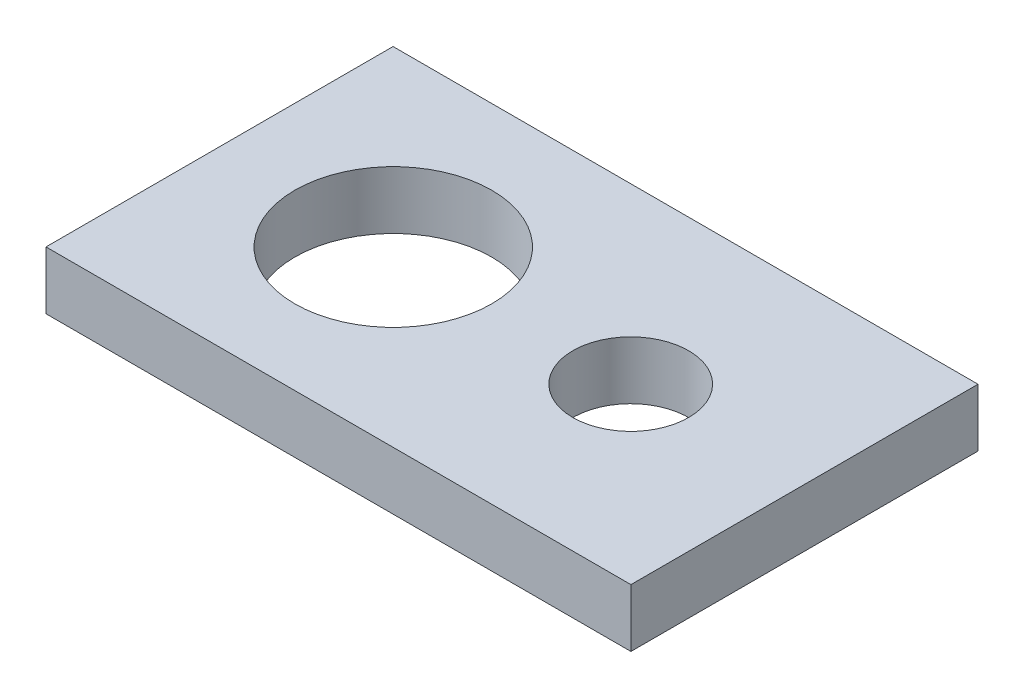
ISO-10303-21;
HEADER;
FILE_DESCRIPTION(('STEP AP214'),'2;1');
FILE_NAME('part.step','',(''),(''),'','','');
FILE_SCHEMA(('AUTOMOTIVE_DESIGN { 1 0 10303 214 1 1 1 1 }'));
ENDSEC;
DATA;
#1=APPLICATION_CONTEXT('core data for automotive mechanical design processes');
#2=APPLICATION_PROTOCOL_DEFINITION('international standard','automotive_design',2000,#1);
#3=PRODUCT_CONTEXT('',#1,'mechanical');
#4=PRODUCT('Part','Part','',(#3));
#5=PRODUCT_RELATED_PRODUCT_CATEGORY('part','',(#4));
#6=PRODUCT_DEFINITION_FORMATION('','',#4);
#7=PRODUCT_DEFINITION_CONTEXT('part definition',#1,'design');
#8=PRODUCT_DEFINITION('design','',#6,#7);
#9=PRODUCT_DEFINITION_SHAPE('','',#8);
#10=(LENGTH_UNIT() NAMED_UNIT(*) SI_UNIT(.MILLI.,.METRE.));
#11=(NAMED_UNIT(*) PLANE_ANGLE_UNIT() SI_UNIT($,.RADIAN.));
#12=(NAMED_UNIT(*) SI_UNIT($,.STERADIAN.) SOLID_ANGLE_UNIT());
#13=UNCERTAINTY_MEASURE_WITH_UNIT(LENGTH_MEASURE(1.E-05),#10,'distance_accuracy_value','');
#14=(GEOMETRIC_REPRESENTATION_CONTEXT(3) GLOBAL_UNCERTAINTY_ASSIGNED_CONTEXT((#13)) GLOBAL_UNIT_ASSIGNED_CONTEXT((#10,
#11,#12)) REPRESENTATION_CONTEXT('',''));
#15=CARTESIAN_POINT('',(0.,0.,0.));
#16=DIRECTION('',(0.,0.,1.));
#17=DIRECTION('',(1.,0.,0.));
#18=AXIS2_PLACEMENT_3D('',#15,#16,#17);
#19=CARTESIAN_POINT('',(50.5,10.,0.));
#20=DIRECTION('',(1.,0.,0.));
#21=DIRECTION('',(0.,0.,-1.));
#22=AXIS2_PLACEMENT_3D('',#19,#20,#21);
#23=PLANE('',#22);
#24=DIRECTION('',(0.,0.,1.));
#25=VECTOR('',#24,1.);
#26=CARTESIAN_POINT('',(50.5,0.,0.));
#27=LINE('',#26,#25);
#28=CARTESIAN_POINT('',(50.5,0.,-29.9660239638685));
#29=VERTEX_POINT('',#28);
#30=CARTESIAN_POINT('',(50.5,0.,29.9660239638685));
#31=VERTEX_POINT('',#30);
#32=EDGE_CURVE('E106',#29,#31,#27,.T.);
#33=ORIENTED_EDGE('',*,*,#32,.F.);
#34=DIRECTION('',(0.,-1.,0.));
#35=VECTOR('',#34,1.);
#36=CARTESIAN_POINT('',(50.5,10.,-29.9660239638685));
#37=LINE('',#36,#35);
#38=CARTESIAN_POINT('',(50.5,10.,-29.9660239638685));
#39=VERTEX_POINT('',#38);
#40=EDGE_CURVE('E11',#39,#29,#37,.T.);
#41=ORIENTED_EDGE('',*,*,#40,.F.);
#42=DIRECTION('',(0.,0.,1.));
#43=VECTOR('',#42,1.);
#44=CARTESIAN_POINT('',(50.5,10.,0.));
#45=LINE('',#44,#43);
#46=CARTESIAN_POINT('',(50.5,10.,29.9660239638685));
#47=VERTEX_POINT('',#46);
#48=EDGE_CURVE('E96',#39,#47,#45,.T.);
#49=ORIENTED_EDGE('',*,*,#48,.T.);
#50=DIRECTION('',(0.,-1.,0.));
#51=VECTOR('',#50,1.);
#52=CARTESIAN_POINT('',(50.5,10.,29.9660239638685));
#53=LINE('',#52,#51);
#54=EDGE_CURVE('E75',#47,#31,#53,.T.);
#55=ORIENTED_EDGE('',*,*,#54,.T.);
#56=EDGE_LOOP('',(#33,#41,#49,#55));
#57=FACE_BOUND('',#56,.T.);
#58=ADVANCED_FACE('F35',(#57),#23,.T.);
#59=CARTESIAN_POINT('',(0.,10.,-29.9660239638685));
#60=DIRECTION('',(0.,0.,-1.));
#61=DIRECTION('',(-1.,0.,0.));
#62=AXIS2_PLACEMENT_3D('',#59,#60,#61);
#63=PLANE('',#62);
#64=DIRECTION('',(1.,0.,0.));
#65=VECTOR('',#64,1.);
#66=CARTESIAN_POINT('',(0.,0.,-29.9660239638685));
#67=LINE('',#66,#65);
#68=CARTESIAN_POINT('',(-50.5,0.,-29.9660239638685));
#69=VERTEX_POINT('',#68);
#70=EDGE_CURVE('E87',#69,#29,#67,.T.);
#71=ORIENTED_EDGE('',*,*,#70,.F.);
#72=DIRECTION('',(0.,-1.,0.));
#73=VECTOR('',#72,1.);
#74=CARTESIAN_POINT('',(-50.5,10.,-29.9660239638685));
#75=LINE('',#74,#73);
#76=CARTESIAN_POINT('',(-50.5,10.,-29.9660239638685));
#77=VERTEX_POINT('',#76);
#78=EDGE_CURVE('E44',#77,#69,#75,.T.);
#79=ORIENTED_EDGE('',*,*,#78,.F.);
#80=DIRECTION('',(1.,0.,0.));
#81=VECTOR('',#80,1.);
#82=CARTESIAN_POINT('',(0.,10.,-29.9660239638685));
#83=LINE('',#82,#81);
#84=EDGE_CURVE('E85',#77,#39,#83,.T.);
#85=ORIENTED_EDGE('',*,*,#84,.T.);
#86=ORIENTED_EDGE('',*,*,#40,.T.);
#87=EDGE_LOOP('',(#71,#79,#85,#86));
#88=FACE_BOUND('',#87,.T.);
#89=ADVANCED_FACE('F83',(#88),#63,.T.);
#90=CARTESIAN_POINT('',(-50.5,10.,0.));
#91=DIRECTION('',(1.,0.,0.));
#92=DIRECTION('',(0.,0.,-1.));
#93=AXIS2_PLACEMENT_3D('',#90,#91,#92);
#94=PLANE('',#93);
#95=DIRECTION('',(0.,0.,1.));
#96=VECTOR('',#95,1.);
#97=CARTESIAN_POINT('',(-50.5,0.,0.));
#98=LINE('',#97,#96);
#99=CARTESIAN_POINT('',(-50.5,0.,29.9660239638685));
#100=VERTEX_POINT('',#99);
#101=EDGE_CURVE('E110',#69,#100,#98,.T.);
#102=ORIENTED_EDGE('',*,*,#101,.T.);
#103=DIRECTION('',(0.,-1.,0.));
#104=VECTOR('',#103,1.);
#105=CARTESIAN_POINT('',(-50.5,10.,29.9660239638685));
#106=LINE('',#105,#104);
#107=CARTESIAN_POINT('',(-50.5,10.,29.9660239638685));
#108=VERTEX_POINT('',#107);
#109=EDGE_CURVE('E90',#108,#100,#106,.T.);
#110=ORIENTED_EDGE('',*,*,#109,.F.);
#111=DIRECTION('',(0.,0.,1.));
#112=VECTOR('',#111,1.);
#113=CARTESIAN_POINT('',(-50.5,10.,0.));
#114=LINE('',#113,#112);
#115=EDGE_CURVE('E92',#77,#108,#114,.T.);
#116=ORIENTED_EDGE('',*,*,#115,.F.);
#117=ORIENTED_EDGE('',*,*,#78,.T.);
#118=EDGE_LOOP('',(#102,#110,#116,#117));
#119=FACE_BOUND('',#118,.T.);
#120=ADVANCED_FACE('F93',(#119),#94,.F.);
#121=CARTESIAN_POINT('',(20.5,10.,0.));
#122=DIRECTION('',(0.,-1.,0.));
#123=DIRECTION('',(0.,0.,-1.));
#124=AXIS2_PLACEMENT_3D('',#121,#122,#123);
#125=CYLINDRICAL_SURFACE('',#124,10.);
#126=CARTESIAN_POINT('',(20.5,10.,0.));
#127=DIRECTION('',(0.,1.,0.));
#128=DIRECTION('',(0.,0.,1.));
#129=AXIS2_PLACEMENT_3D('',#126,#127,#128);
#130=CIRCLE('',#129,10.);
#131=CARTESIAN_POINT('',(20.5,10.,10.));
#132=VERTEX_POINT('',#131);
#133=EDGE_CURVE('E98',#132,#132,#130,.T.);
#134=ORIENTED_EDGE('',*,*,#133,.T.);
#135=EDGE_LOOP('',(#134));
#136=FACE_BOUND('',#135,.T.);
#137=CARTESIAN_POINT('',(20.5,0.,0.));
#138=DIRECTION('',(0.,1.,0.));
#139=DIRECTION('',(0.,0.,1.));
#140=AXIS2_PLACEMENT_3D('',#137,#138,#139);
#141=CIRCLE('',#140,10.);
#142=CARTESIAN_POINT('',(20.5,0.,10.));
#143=VERTEX_POINT('',#142);
#144=EDGE_CURVE('E103',#143,#143,#141,.T.);
#145=ORIENTED_EDGE('',*,*,#144,.F.);
#146=EDGE_LOOP('',(#145));
#147=FACE_BOUND('',#146,.T.);
#148=ADVANCED_FACE('F37',(#136,#147),#125,.F.);
#149=CARTESIAN_POINT('',(0.,10.,29.9660239638685));
#150=DIRECTION('',(0.,0.,-1.));
#151=DIRECTION('',(-1.,0.,0.));
#152=AXIS2_PLACEMENT_3D('',#149,#150,#151);
#153=PLANE('',#152);
#154=DIRECTION('',(1.,0.,0.));
#155=VECTOR('',#154,1.);
#156=CARTESIAN_POINT('',(0.,0.,29.9660239638685));
#157=LINE('',#156,#155);
#158=EDGE_CURVE('E68',#100,#31,#157,.T.);
#159=ORIENTED_EDGE('',*,*,#158,.T.);
#160=ORIENTED_EDGE('',*,*,#54,.F.);
#161=DIRECTION('',(1.,0.,0.));
#162=VECTOR('',#161,1.);
#163=CARTESIAN_POINT('',(0.,10.,29.9660239638685));
#164=LINE('',#163,#162);
#165=EDGE_CURVE('E52',#108,#47,#164,.T.);
#166=ORIENTED_EDGE('',*,*,#165,.F.);
#167=ORIENTED_EDGE('',*,*,#109,.T.);
#168=EDGE_LOOP('',(#159,#160,#166,#167));
#169=FACE_BOUND('',#168,.T.);
#170=ADVANCED_FACE('F115',(#169),#153,.F.);
#171=CARTESIAN_POINT('',(0.,10.,0.));
#172=DIRECTION('',(0.,1.,0.));
#173=DIRECTION('',(0.,0.,1.));
#174=AXIS2_PLACEMENT_3D('',#171,#172,#173);
#175=PLANE('',#174);
#176=CARTESIAN_POINT('',(-20.5,10.,0.));
#177=DIRECTION('',(0.,1.,0.));
#178=DIRECTION('',(0.,0.,1.));
#179=AXIS2_PLACEMENT_3D('',#176,#177,#178);
#180=CIRCLE('',#179,17.);
#181=CARTESIAN_POINT('',(-20.5,10.,17.));
#182=VERTEX_POINT('',#181);
#183=EDGE_CURVE('E144',#182,#182,#180,.T.);
#184=ORIENTED_EDGE('',*,*,#183,.F.);
#185=EDGE_LOOP('',(#184));
#186=FACE_BOUND('',#185,.T.);
#187=ORIENTED_EDGE('',*,*,#133,.F.);
#188=EDGE_LOOP('',(#187));
#189=FACE_BOUND('',#188,.T.);
#190=ORIENTED_EDGE('',*,*,#48,.F.);
#191=ORIENTED_EDGE('',*,*,#84,.F.);
#192=ORIENTED_EDGE('',*,*,#115,.T.);
#193=ORIENTED_EDGE('',*,*,#165,.T.);
#194=EDGE_LOOP('',(#190,#191,#192,#193));
#195=FACE_BOUND('',#194,.T.);
#196=ADVANCED_FACE('F95',(#186,#189,#195),#175,.T.);
#197=CARTESIAN_POINT('',(0.,0.,0.));
#198=DIRECTION('',(0.,1.,0.));
#199=DIRECTION('',(0.,0.,1.));
#200=AXIS2_PLACEMENT_3D('',#197,#198,#199);
#201=PLANE('',#200);
#202=CARTESIAN_POINT('',(-20.5,0.,0.));
#203=DIRECTION('',(0.,1.,0.));
#204=DIRECTION('',(0.,0.,1.));
#205=AXIS2_PLACEMENT_3D('',#202,#203,#204);
#206=CIRCLE('',#205,17.);
#207=CARTESIAN_POINT('',(-20.5,0.,17.));
#208=VERTEX_POINT('',#207);
#209=EDGE_CURVE('E107',#208,#208,#206,.T.);
#210=ORIENTED_EDGE('',*,*,#209,.T.);
#211=EDGE_LOOP('',(#210));
#212=FACE_BOUND('',#211,.T.);
#213=ORIENTED_EDGE('',*,*,#144,.T.);
#214=EDGE_LOOP('',(#213));
#215=FACE_BOUND('',#214,.T.);
#216=ORIENTED_EDGE('',*,*,#32,.T.);
#217=ORIENTED_EDGE('',*,*,#158,.F.);
#218=ORIENTED_EDGE('',*,*,#101,.F.);
#219=ORIENTED_EDGE('',*,*,#70,.T.);
#220=EDGE_LOOP('',(#216,#217,#218,#219));
#221=FACE_BOUND('',#220,.T.);
#222=ADVANCED_FACE('F116',(#212,#215,#221),#201,.F.);
#223=CARTESIAN_POINT('',(-20.5,0.,0.));
#224=DIRECTION('',(0.,1.,0.));
#225=DIRECTION('',(0.,0.,1.));
#226=AXIS2_PLACEMENT_3D('',#223,#224,#225);
#227=CYLINDRICAL_SURFACE('',#226,17.);
#228=ORIENTED_EDGE('',*,*,#209,.F.);
#229=EDGE_LOOP('',(#228));
#230=FACE_BOUND('',#229,.T.);
#231=ORIENTED_EDGE('',*,*,#183,.T.);
#232=EDGE_LOOP('',(#231));
#233=FACE_BOUND('',#232,.T.);
#234=ADVANCED_FACE('F129',(#230,#233),#227,.F.);
#235=CLOSED_SHELL('',(#58,#89,#120,#148,#170,#196,#222,#234));
#236=MANIFOLD_SOLID_BREP('B2',#235);
#237=ADVANCED_BREP_SHAPE_REPRESENTATION('',(#18,#236),#14);
#238=SHAPE_DEFINITION_REPRESENTATION(#9,#237);
ENDSEC;
END-ISO-10303-21;
